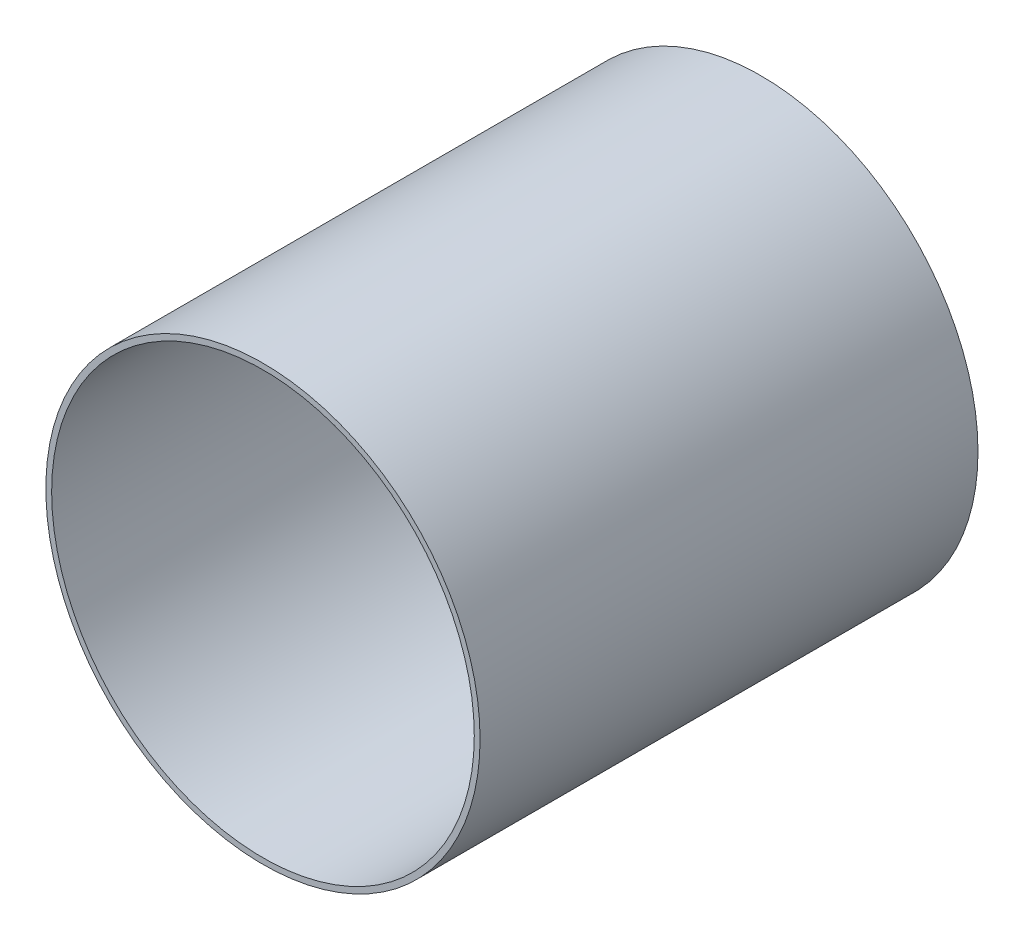
ISO-10303-21;
HEADER;
FILE_DESCRIPTION(('STEP AP214'),'2;1');
FILE_NAME('part.step','',(''),(''),'','','');
FILE_SCHEMA(('AUTOMOTIVE_DESIGN { 1 0 10303 214 1 1 1 1 }'));
ENDSEC;
DATA;
#1=APPLICATION_CONTEXT('core data for automotive mechanical design processes');
#2=APPLICATION_PROTOCOL_DEFINITION('international standard','automotive_design',2000,#1);
#3=PRODUCT_CONTEXT('',#1,'mechanical');
#4=PRODUCT('Part','Part','',(#3));
#5=PRODUCT_RELATED_PRODUCT_CATEGORY('part','',(#4));
#6=PRODUCT_DEFINITION_FORMATION('','',#4);
#7=PRODUCT_DEFINITION_CONTEXT('part definition',#1,'design');
#8=PRODUCT_DEFINITION('design','',#6,#7);
#9=PRODUCT_DEFINITION_SHAPE('','',#8);
#10=(LENGTH_UNIT() NAMED_UNIT(*) SI_UNIT(.MILLI.,.METRE.));
#11=(NAMED_UNIT(*) PLANE_ANGLE_UNIT() SI_UNIT($,.RADIAN.));
#12=(NAMED_UNIT(*) SI_UNIT($,.STERADIAN.) SOLID_ANGLE_UNIT());
#13=UNCERTAINTY_MEASURE_WITH_UNIT(LENGTH_MEASURE(1.E-05),#10,'distance_accuracy_value','');
#14=(GEOMETRIC_REPRESENTATION_CONTEXT(3) GLOBAL_UNCERTAINTY_ASSIGNED_CONTEXT((#13)) GLOBAL_UNIT_ASSIGNED_CONTEXT((#10,
#11,#12)) REPRESENTATION_CONTEXT('',''));
#15=CARTESIAN_POINT('',(0.,0.,0.));
#16=DIRECTION('',(0.,0.,1.));
#17=DIRECTION('',(1.,0.,0.));
#18=AXIS2_PLACEMENT_3D('',#15,#16,#17);
#19=CARTESIAN_POINT('',(0.,0.,86.));
#20=DIRECTION('',(0.,0.,1.));
#21=DIRECTION('',(1.,0.,0.));
#22=AXIS2_PLACEMENT_3D('',#19,#20,#21);
#23=PLANE('',#22);
#24=CARTESIAN_POINT('',(0.,0.,86.));
#25=DIRECTION('',(0.,0.,1.));
#26=DIRECTION('',(1.,0.,0.));
#27=AXIS2_PLACEMENT_3D('',#24,#25,#26);
#28=CIRCLE('',#27,37.5);
#29=CARTESIAN_POINT('',(37.5,0.,86.));
#30=VERTEX_POINT('',#29);
#31=EDGE_CURVE('E10',#30,#30,#28,.T.);
#32=ORIENTED_EDGE('',*,*,#31,.T.);
#33=EDGE_LOOP('',(#32));
#34=FACE_BOUND('',#33,.T.);
#35=CARTESIAN_POINT('',(0.,0.,86.));
#36=DIRECTION('',(0.,0.,1.));
#37=DIRECTION('',(1.,0.,0.));
#38=AXIS2_PLACEMENT_3D('',#35,#36,#37);
#39=CIRCLE('',#38,36.5);
#40=CARTESIAN_POINT('',(36.5,0.,86.));
#41=VERTEX_POINT('',#40);
#42=EDGE_CURVE('E42',#41,#41,#39,.T.);
#43=ORIENTED_EDGE('',*,*,#42,.F.);
#44=EDGE_LOOP('',(#43));
#45=FACE_BOUND('',#44,.T.);
#46=ADVANCED_FACE('F31',(#34,#45),#23,.T.);
#47=CARTESIAN_POINT('',(0.,0.,0.));
#48=DIRECTION('',(0.,0.,1.));
#49=DIRECTION('',(1.,0.,0.));
#50=AXIS2_PLACEMENT_3D('',#47,#48,#49);
#51=PLANE('',#50);
#52=CARTESIAN_POINT('',(0.,0.,0.));
#53=DIRECTION('',(0.,0.,1.));
#54=DIRECTION('',(1.,0.,0.));
#55=AXIS2_PLACEMENT_3D('',#52,#53,#54);
#56=CIRCLE('',#55,37.5);
#57=CARTESIAN_POINT('',(37.5,0.,0.));
#58=VERTEX_POINT('',#57);
#59=EDGE_CURVE('E35',#58,#58,#56,.T.);
#60=ORIENTED_EDGE('',*,*,#59,.F.);
#61=EDGE_LOOP('',(#60));
#62=FACE_BOUND('',#61,.T.);
#63=CARTESIAN_POINT('',(0.,0.,0.));
#64=DIRECTION('',(0.,0.,1.));
#65=DIRECTION('',(1.,0.,0.));
#66=AXIS2_PLACEMENT_3D('',#63,#64,#65);
#67=CIRCLE('',#66,36.5);
#68=CARTESIAN_POINT('',(36.5,0.,0.));
#69=VERTEX_POINT('',#68);
#70=EDGE_CURVE('E44',#69,#69,#67,.T.);
#71=ORIENTED_EDGE('',*,*,#70,.T.);
#72=EDGE_LOOP('',(#71));
#73=FACE_BOUND('',#72,.T.);
#74=ADVANCED_FACE('F54',(#62,#73),#51,.F.);
#75=CARTESIAN_POINT('',(0.,0.,86.));
#76=DIRECTION('',(0.,0.,-1.));
#77=DIRECTION('',(-1.,0.,0.));
#78=AXIS2_PLACEMENT_3D('',#75,#76,#77);
#79=CYLINDRICAL_SURFACE('',#78,37.5);
#80=ORIENTED_EDGE('',*,*,#31,.F.);
#81=EDGE_LOOP('',(#80));
#82=FACE_BOUND('',#81,.T.);
#83=ORIENTED_EDGE('',*,*,#59,.T.);
#84=EDGE_LOOP('',(#83));
#85=FACE_BOUND('',#84,.T.);
#86=ADVANCED_FACE('F33',(#82,#85),#79,.T.);
#87=CARTESIAN_POINT('',(0.,0.,86.));
#88=DIRECTION('',(0.,0.,-1.));
#89=DIRECTION('',(-1.,0.,0.));
#90=AXIS2_PLACEMENT_3D('',#87,#88,#89);
#91=CYLINDRICAL_SURFACE('',#90,36.5);
#92=ORIENTED_EDGE('',*,*,#42,.T.);
#93=EDGE_LOOP('',(#92));
#94=FACE_BOUND('',#93,.T.);
#95=ORIENTED_EDGE('',*,*,#70,.F.);
#96=EDGE_LOOP('',(#95));
#97=FACE_BOUND('',#96,.T.);
#98=ADVANCED_FACE('F50',(#94,#97),#91,.F.);
#99=CLOSED_SHELL('',(#46,#74,#86,#98));
#100=MANIFOLD_SOLID_BREP('B2',#99);
#101=ADVANCED_BREP_SHAPE_REPRESENTATION('',(#18,#100),#14);
#102=SHAPE_DEFINITION_REPRESENTATION(#9,#101);
ENDSEC;
END-ISO-10303-21;
